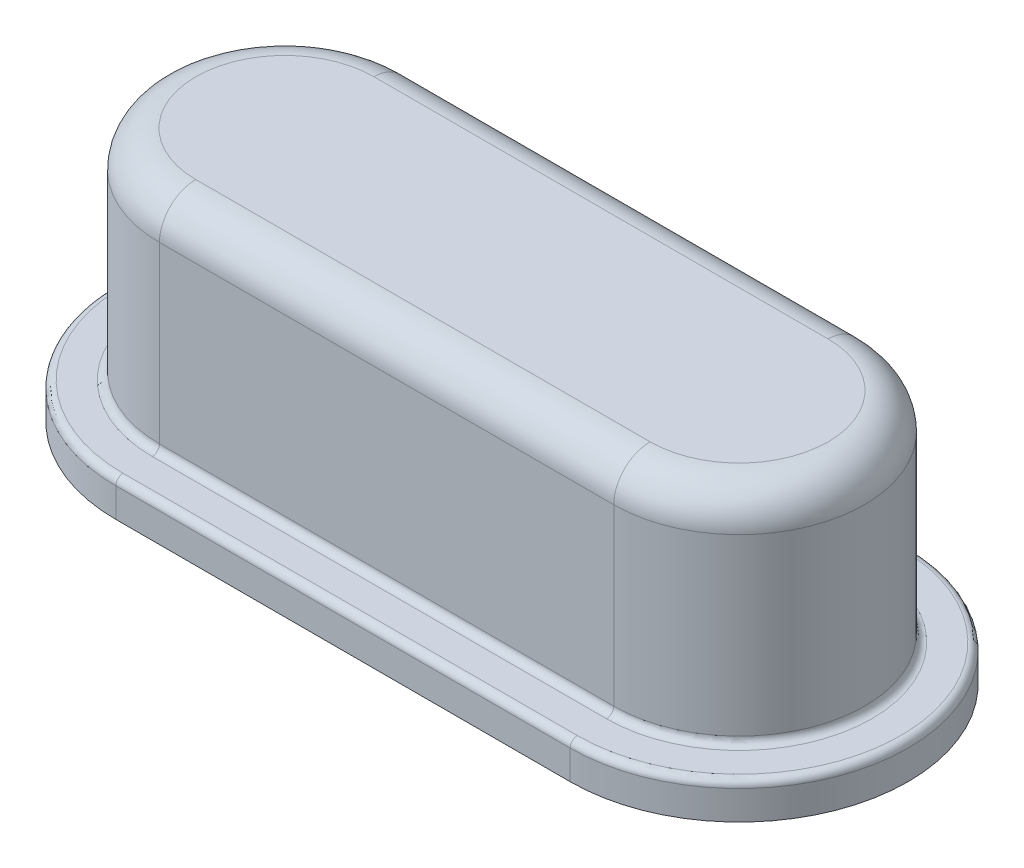
ISO-10303-21;
HEADER;
FILE_DESCRIPTION(('STEP AP214'),'2;1');
FILE_NAME('part.step','',(''),(''),'','','');
FILE_SCHEMA(('AUTOMOTIVE_DESIGN { 1 0 10303 214 1 1 1 1 }'));
ENDSEC;
DATA;
#1=APPLICATION_CONTEXT('core data for automotive mechanical design processes');
#2=APPLICATION_PROTOCOL_DEFINITION('international standard','automotive_design',2000,#1);
#3=PRODUCT_CONTEXT('',#1,'mechanical');
#4=PRODUCT('Part','Part','',(#3));
#5=PRODUCT_RELATED_PRODUCT_CATEGORY('part','',(#4));
#6=PRODUCT_DEFINITION_FORMATION('','',#4);
#7=PRODUCT_DEFINITION_CONTEXT('part definition',#1,'design');
#8=PRODUCT_DEFINITION('design','',#6,#7);
#9=PRODUCT_DEFINITION_SHAPE('','',#8);
#10=(LENGTH_UNIT() NAMED_UNIT(*) SI_UNIT(.MILLI.,.METRE.));
#11=(NAMED_UNIT(*) PLANE_ANGLE_UNIT() SI_UNIT($,.RADIAN.));
#12=(NAMED_UNIT(*) SI_UNIT($,.STERADIAN.) SOLID_ANGLE_UNIT());
#13=UNCERTAINTY_MEASURE_WITH_UNIT(LENGTH_MEASURE(1.E-05),#10,'distance_accuracy_value','');
#14=(GEOMETRIC_REPRESENTATION_CONTEXT(3) GLOBAL_UNCERTAINTY_ASSIGNED_CONTEXT((#13)) GLOBAL_UNIT_ASSIGNED_CONTEXT((#10,
#11,#12)) REPRESENTATION_CONTEXT('',''));
#15=CARTESIAN_POINT('',(0.,0.,0.));
#16=DIRECTION('',(0.,0.,1.));
#17=DIRECTION('',(1.,0.,0.));
#18=AXIS2_PLACEMENT_3D('',#15,#16,#17);
#19=CARTESIAN_POINT('',(-3.125,3.5,0.));
#20=DIRECTION('',(0.,1.,0.));
#21=DIRECTION('',(0.,0.,1.));
#22=AXIS2_PLACEMENT_3D('',#19,#20,#21);
#23=PLANE('',#22);
#24=CARTESIAN_POINT('',(-3.125,3.5,0.));
#25=DIRECTION('',(0.,-1.,0.));
#26=DIRECTION('',(0.,0.,1.));
#27=AXIS2_PLACEMENT_3D('',#24,#25,#26);
#28=CIRCLE('',#27,1.225);
#29=CARTESIAN_POINT('',(-3.125,3.5,1.225));
#30=VERTEX_POINT('',#29);
#31=CARTESIAN_POINT('',(-3.125,3.5,-1.225));
#32=VERTEX_POINT('',#31);
#33=EDGE_CURVE('P0_E336',#30,#32,#28,.T.);
#34=ORIENTED_EDGE('',*,*,#33,.F.);
#35=DIRECTION('',(-1.,0.,0.));
#36=VECTOR('',#35,1.);
#37=CARTESIAN_POINT('',(-3.125,3.5,1.225));
#38=LINE('',#37,#36);
#39=CARTESIAN_POINT('',(3.125,3.5,1.225));
#40=VERTEX_POINT('',#39);
#41=EDGE_CURVE('P0_E321',#40,#30,#38,.T.);
#42=ORIENTED_EDGE('',*,*,#41,.F.);
#43=CARTESIAN_POINT('',(3.125,3.5,0.));
#44=DIRECTION('',(0.,-1.,0.));
#45=DIRECTION('',(0.,0.,-1.));
#46=AXIS2_PLACEMENT_3D('',#43,#44,#45);
#47=CIRCLE('',#46,1.225);
#48=CARTESIAN_POINT('',(3.125,3.5,-1.225));
#49=VERTEX_POINT('',#48);
#50=EDGE_CURVE('P0_E314',#49,#40,#47,.T.);
#51=ORIENTED_EDGE('',*,*,#50,.F.);
#52=DIRECTION('',(1.,0.,0.));
#53=VECTOR('',#52,1.);
#54=CARTESIAN_POINT('',(-3.125,3.5,-1.225));
#55=LINE('',#54,#53);
#56=EDGE_CURVE('P0_E300',#32,#49,#55,.T.);
#57=ORIENTED_EDGE('',*,*,#56,.F.);
#58=EDGE_LOOP('',(#34,#42,#51,#57));
#59=FACE_BOUND('',#58,.T.);
#60=ADVANCED_FACE('P0_F16',(#59),#23,.T.);
#61=CARTESIAN_POINT('',(-3.125,3.,-1.225));
#62=DIRECTION('',(1.,0.,0.));
#63=DIRECTION('',(0.,0.,-1.));
#64=AXIS2_PLACEMENT_3D('',#61,#62,#63);
#65=CYLINDRICAL_SURFACE('',#64,0.5);
#66=CARTESIAN_POINT('',(-3.125,3.,-1.225));
#67=DIRECTION('',(-1.,0.,0.));
#68=DIRECTION('',(0.,0.,-1.));
#69=AXIS2_PLACEMENT_3D('',#66,#67,#68);
#70=CIRCLE('',#69,0.5);
#71=CARTESIAN_POINT('',(-3.125,3.,-1.725));
#72=VERTEX_POINT('',#71);
#73=EDGE_CURVE('P0_E306',#32,#72,#70,.T.);
#74=ORIENTED_EDGE('',*,*,#73,.F.);
#75=ORIENTED_EDGE('',*,*,#56,.T.);
#76=CARTESIAN_POINT('',(3.125,3.,-1.225));
#77=DIRECTION('',(-1.,0.,0.));
#78=DIRECTION('',(0.,0.,-1.));
#79=AXIS2_PLACEMENT_3D('',#76,#77,#78);
#80=CIRCLE('',#79,0.5);
#81=CARTESIAN_POINT('',(3.125,3.,-1.725));
#82=VERTEX_POINT('',#81);
#83=EDGE_CURVE('P0_E304',#82,#49,#80,.F.);
#84=ORIENTED_EDGE('',*,*,#83,.F.);
#85=DIRECTION('',(1.,0.,0.));
#86=VECTOR('',#85,1.);
#87=CARTESIAN_POINT('',(-3.125,3.,-1.725));
#88=LINE('',#87,#86);
#89=EDGE_CURVE('P0_E390',#82,#72,#88,.F.);
#90=ORIENTED_EDGE('',*,*,#89,.T.);
#91=EDGE_LOOP('',(#74,#75,#84,#90));
#92=FACE_BOUND('',#91,.T.);
#93=ADVANCED_FACE('P0_F302',(#92),#65,.T.);
#94=CARTESIAN_POINT('',(3.125,3.,0.));
#95=DIRECTION('',(0.,1.,0.));
#96=DIRECTION('',(0.,0.,1.));
#97=AXIS2_PLACEMENT_3D('',#94,#95,#96);
#98=TOROIDAL_SURFACE('',#97,1.225,0.5);
#99=ORIENTED_EDGE('',*,*,#83,.T.);
#100=ORIENTED_EDGE('',*,*,#50,.T.);
#101=CARTESIAN_POINT('',(3.125,3.,1.225));
#102=DIRECTION('',(-1.,0.,0.));
#103=DIRECTION('',(0.,0.,1.));
#104=AXIS2_PLACEMENT_3D('',#101,#102,#103);
#105=CIRCLE('',#104,0.5);
#106=CARTESIAN_POINT('',(3.125,3.,1.725));
#107=VERTEX_POINT('',#106);
#108=EDGE_CURVE('P0_E322',#107,#40,#105,.T.);
#109=ORIENTED_EDGE('',*,*,#108,.F.);
#110=CARTESIAN_POINT('',(3.125,3.,0.));
#111=DIRECTION('',(0.,-1.,0.));
#112=DIRECTION('',(0.,0.,-1.));
#113=AXIS2_PLACEMENT_3D('',#110,#111,#112);
#114=CIRCLE('',#113,1.725);
#115=EDGE_CURVE('P0_E317',#82,#107,#114,.T.);
#116=ORIENTED_EDGE('',*,*,#115,.F.);
#117=EDGE_LOOP('',(#99,#100,#109,#116));
#118=FACE_BOUND('',#117,.T.);
#119=ADVANCED_FACE('P0_F312',(#118),#98,.T.);
#120=CARTESIAN_POINT('',(-3.125,3.,1.225));
#121=DIRECTION('',(-1.,0.,0.));
#122=DIRECTION('',(0.,0.,1.));
#123=AXIS2_PLACEMENT_3D('',#120,#121,#122);
#124=CYLINDRICAL_SURFACE('',#123,0.5);
#125=ORIENTED_EDGE('',*,*,#108,.T.);
#126=ORIENTED_EDGE('',*,*,#41,.T.);
#127=CARTESIAN_POINT('',(-3.125,3.,1.225));
#128=DIRECTION('',(1.,0.,0.));
#129=DIRECTION('',(0.,0.,1.));
#130=AXIS2_PLACEMENT_3D('',#127,#128,#129);
#131=CIRCLE('',#130,0.5);
#132=CARTESIAN_POINT('',(-3.125,3.,1.725));
#133=VERTEX_POINT('',#132);
#134=EDGE_CURVE('P0_E379',#133,#30,#131,.F.);
#135=ORIENTED_EDGE('',*,*,#134,.F.);
#136=DIRECTION('',(-1.,0.,0.));
#137=VECTOR('',#136,1.);
#138=CARTESIAN_POINT('',(-3.125,3.,1.725));
#139=LINE('',#138,#137);
#140=EDGE_CURVE('P0_E373',#133,#107,#139,.F.);
#141=ORIENTED_EDGE('',*,*,#140,.T.);
#142=EDGE_LOOP('',(#125,#126,#135,#141));
#143=FACE_BOUND('',#142,.T.);
#144=ADVANCED_FACE('P0_F365',(#143),#124,.T.);
#145=CARTESIAN_POINT('',(-3.125,3.,0.));
#146=DIRECTION('',(0.,1.,0.));
#147=DIRECTION('',(0.,0.,1.));
#148=AXIS2_PLACEMENT_3D('',#145,#146,#147);
#149=TOROIDAL_SURFACE('',#148,1.225,0.5);
#150=ORIENTED_EDGE('',*,*,#73,.T.);
#151=CARTESIAN_POINT('',(-3.125,3.,0.));
#152=DIRECTION('',(0.,-1.,0.));
#153=DIRECTION('',(0.,0.,-1.));
#154=AXIS2_PLACEMENT_3D('',#151,#152,#153);
#155=CIRCLE('',#154,1.725);
#156=EDGE_CURVE('P0_E383',#133,#72,#155,.T.);
#157=ORIENTED_EDGE('',*,*,#156,.F.);
#158=ORIENTED_EDGE('',*,*,#134,.T.);
#159=ORIENTED_EDGE('',*,*,#33,.T.);
#160=EDGE_LOOP('',(#150,#157,#158,#159));
#161=FACE_BOUND('',#160,.T.);
#162=ADVANCED_FACE('P0_F353',(#161),#149,.T.);
#163=CARTESIAN_POINT('',(-3.125,3.5,-1.725));
#164=DIRECTION('',(0.,0.,1.));
#165=DIRECTION('',(1.,0.,0.));
#166=AXIS2_PLACEMENT_3D('',#163,#164,#165);
#167=PLANE('',#166);
#168=DIRECTION('',(-1.,0.,0.));
#169=VECTOR('',#168,1.);
#170=CARTESIAN_POINT('',(-3.125,0.6,-1.725));
#171=LINE('',#170,#169);
#172=CARTESIAN_POINT('',(3.125,0.6,-1.725));
#173=VERTEX_POINT('',#172);
#174=CARTESIAN_POINT('',(-3.125,0.6,-1.725));
#175=VERTEX_POINT('',#174);
#176=EDGE_CURVE('P0_E386',#173,#175,#171,.T.);
#177=ORIENTED_EDGE('',*,*,#176,.T.);
#178=DIRECTION('',(0.,-1.,0.));
#179=VECTOR('',#178,1.);
#180=CARTESIAN_POINT('',(-3.125,3.5,-1.725));
#181=LINE('',#180,#179);
#182=EDGE_CURVE('P0_E614',#72,#175,#181,.T.);
#183=ORIENTED_EDGE('',*,*,#182,.F.);
#184=ORIENTED_EDGE('',*,*,#89,.F.);
#185=DIRECTION('',(0.,-1.,0.));
#186=VECTOR('',#185,1.);
#187=CARTESIAN_POINT('',(3.125,3.5,-1.725));
#188=LINE('',#187,#186);
#189=EDGE_CURVE('P0_E392',#173,#82,#188,.F.);
#190=ORIENTED_EDGE('',*,*,#189,.F.);
#191=EDGE_LOOP('',(#177,#183,#184,#190));
#192=FACE_BOUND('',#191,.T.);
#193=ADVANCED_FACE('P0_F364',(#192),#167,.F.);
#194=CARTESIAN_POINT('',(3.125,3.5,0.));
#195=DIRECTION('',(0.,-1.,0.));
#196=DIRECTION('',(0.,0.,-1.));
#197=AXIS2_PLACEMENT_3D('',#194,#195,#196);
#198=CYLINDRICAL_SURFACE('',#197,1.725);
#199=ORIENTED_EDGE('',*,*,#189,.T.);
#200=ORIENTED_EDGE('',*,*,#115,.T.);
#201=DIRECTION('',(0.,1.,0.));
#202=VECTOR('',#201,1.);
#203=CARTESIAN_POINT('',(3.125,3.5,1.725));
#204=LINE('',#203,#202);
#205=CARTESIAN_POINT('',(3.125,0.6,1.725));
#206=VERTEX_POINT('',#205);
#207=EDGE_CURVE('P0_E376',#107,#206,#204,.F.);
#208=ORIENTED_EDGE('',*,*,#207,.T.);
#209=CARTESIAN_POINT('',(3.125,0.6,0.));
#210=DIRECTION('',(0.,1.,0.));
#211=DIRECTION('',(0.,0.,1.));
#212=AXIS2_PLACEMENT_3D('',#209,#210,#211);
#213=CIRCLE('',#212,1.725);
#214=EDGE_CURVE('P0_E624',#206,#173,#213,.T.);
#215=ORIENTED_EDGE('',*,*,#214,.T.);
#216=EDGE_LOOP('',(#199,#200,#208,#215));
#217=FACE_BOUND('',#216,.T.);
#218=ADVANCED_FACE('P0_F506',(#217),#198,.T.);
#219=CARTESIAN_POINT('',(-3.125,3.5,1.725));
#220=DIRECTION('',(0.,0.,-1.));
#221=DIRECTION('',(-1.,0.,0.));
#222=AXIS2_PLACEMENT_3D('',#219,#220,#221);
#223=PLANE('',#222);
#224=DIRECTION('',(1.,0.,0.));
#225=VECTOR('',#224,1.);
#226=CARTESIAN_POINT('',(-3.125,0.6,1.725));
#227=LINE('',#226,#225);
#228=CARTESIAN_POINT('',(-3.125,0.6,1.725));
#229=VERTEX_POINT('',#228);
#230=EDGE_CURVE('P0_E611',#229,#206,#227,.T.);
#231=ORIENTED_EDGE('',*,*,#230,.T.);
#232=ORIENTED_EDGE('',*,*,#207,.F.);
#233=ORIENTED_EDGE('',*,*,#140,.F.);
#234=DIRECTION('',(0.,-1.,0.));
#235=VECTOR('',#234,1.);
#236=CARTESIAN_POINT('',(-3.125,3.5,1.725));
#237=LINE('',#236,#235);
#238=EDGE_CURVE('P0_E387',#229,#133,#237,.F.);
#239=ORIENTED_EDGE('',*,*,#238,.F.);
#240=EDGE_LOOP('',(#231,#232,#233,#239));
#241=FACE_BOUND('',#240,.T.);
#242=ADVANCED_FACE('P0_F498',(#241),#223,.F.);
#243=CARTESIAN_POINT('',(-3.125,3.5,0.));
#244=DIRECTION('',(0.,-1.,0.));
#245=DIRECTION('',(0.,0.,-1.));
#246=AXIS2_PLACEMENT_3D('',#243,#244,#245);
#247=CYLINDRICAL_SURFACE('',#246,1.725);
#248=ORIENTED_EDGE('',*,*,#238,.T.);
#249=ORIENTED_EDGE('',*,*,#156,.T.);
#250=ORIENTED_EDGE('',*,*,#182,.T.);
#251=CARTESIAN_POINT('',(-3.125,0.6,0.));
#252=DIRECTION('',(0.,1.,0.));
#253=DIRECTION('',(0.,0.,1.));
#254=AXIS2_PLACEMENT_3D('',#251,#252,#253);
#255=CIRCLE('',#254,1.725);
#256=EDGE_CURVE('P0_E645',#175,#229,#255,.T.);
#257=ORIENTED_EDGE('',*,*,#256,.T.);
#258=EDGE_LOOP('',(#248,#249,#250,#257));
#259=FACE_BOUND('',#258,.T.);
#260=ADVANCED_FACE('P0_F490',(#259),#247,.T.);
#261=CARTESIAN_POINT('',(-3.125,0.6,-1.825));
#262=DIRECTION('',(-1.,0.,0.));
#263=DIRECTION('',(0.,0.,1.));
#264=AXIS2_PLACEMENT_3D('',#261,#262,#263);
#265=CYLINDRICAL_SURFACE('',#264,0.1);
#266=ORIENTED_EDGE('',*,*,#176,.F.);
#267=CARTESIAN_POINT('',(3.125,0.6,-1.825));
#268=DIRECTION('',(-1.,0.,0.));
#269=DIRECTION('',(0.,0.,-1.));
#270=AXIS2_PLACEMENT_3D('',#267,#268,#269);
#271=CIRCLE('',#270,0.1);
#272=CARTESIAN_POINT('',(3.125,0.5,-1.825));
#273=VERTEX_POINT('',#272);
#274=EDGE_CURVE('P0_E630',#173,#273,#271,.F.);
#275=ORIENTED_EDGE('',*,*,#274,.T.);
#276=DIRECTION('',(1.,0.,0.));
#277=VECTOR('',#276,1.);
#278=CARTESIAN_POINT('',(-3.125,0.5,-1.825));
#279=LINE('',#278,#277);
#280=CARTESIAN_POINT('',(-3.125,0.5,-1.825));
#281=VERTEX_POINT('',#280);
#282=EDGE_CURVE('P0_E665',#281,#273,#279,.T.);
#283=ORIENTED_EDGE('',*,*,#282,.F.);
#284=CARTESIAN_POINT('',(-3.125,0.6,-1.825));
#285=DIRECTION('',(-1.,0.,0.));
#286=DIRECTION('',(0.,0.,-1.));
#287=AXIS2_PLACEMENT_3D('',#284,#285,#286);
#288=CIRCLE('',#287,0.1);
#289=EDGE_CURVE('P0_E663',#281,#175,#288,.T.);
#290=ORIENTED_EDGE('',*,*,#289,.T.);
#291=EDGE_LOOP('',(#266,#275,#283,#290));
#292=FACE_BOUND('',#291,.T.);
#293=ADVANCED_FACE('P0_F482',(#292),#265,.F.);
#294=CARTESIAN_POINT('',(3.125,0.6,0.));
#295=DIRECTION('',(0.,1.,0.));
#296=DIRECTION('',(0.,0.,1.));
#297=AXIS2_PLACEMENT_3D('',#294,#295,#296);
#298=TOROIDAL_SURFACE('',#297,1.825,0.1);
#299=CARTESIAN_POINT('',(3.125,0.5,0.));
#300=DIRECTION('',(0.,1.,0.));
#301=DIRECTION('',(0.,0.,1.));
#302=AXIS2_PLACEMENT_3D('',#299,#300,#301);
#303=CIRCLE('',#302,1.825);
#304=CARTESIAN_POINT('',(3.125,0.5,1.825));
#305=VERTEX_POINT('',#304);
#306=EDGE_CURVE('P0_E174',#273,#305,#303,.F.);
#307=ORIENTED_EDGE('',*,*,#306,.F.);
#308=ORIENTED_EDGE('',*,*,#274,.F.);
#309=ORIENTED_EDGE('',*,*,#214,.F.);
#310=CARTESIAN_POINT('',(3.125,0.6,1.825));
#311=DIRECTION('',(1.,0.,0.));
#312=DIRECTION('',(0.,0.,-1.));
#313=AXIS2_PLACEMENT_3D('',#310,#311,#312);
#314=CIRCLE('',#313,0.1);
#315=EDGE_CURVE('P0_E634',#206,#305,#314,.F.);
#316=ORIENTED_EDGE('',*,*,#315,.T.);
#317=EDGE_LOOP('',(#307,#308,#309,#316));
#318=FACE_BOUND('',#317,.T.);
#319=ADVANCED_FACE('P0_F475',(#318),#298,.F.);
#320=CARTESIAN_POINT('',(-3.125,0.6,1.825));
#321=DIRECTION('',(1.,0.,0.));
#322=DIRECTION('',(0.,0.,-1.));
#323=AXIS2_PLACEMENT_3D('',#320,#321,#322);
#324=CYLINDRICAL_SURFACE('',#323,0.1);
#325=DIRECTION('',(1.,0.,0.));
#326=VECTOR('',#325,1.);
#327=CARTESIAN_POINT('',(-3.125,0.5,1.825));
#328=LINE('',#327,#326);
#329=CARTESIAN_POINT('',(-3.125,0.5,1.825));
#330=VERTEX_POINT('',#329);
#331=EDGE_CURVE('P0_E680',#305,#330,#328,.F.);
#332=ORIENTED_EDGE('',*,*,#331,.F.);
#333=ORIENTED_EDGE('',*,*,#315,.F.);
#334=ORIENTED_EDGE('',*,*,#230,.F.);
#335=CARTESIAN_POINT('',(-3.125,0.6,1.825));
#336=DIRECTION('',(1.,0.,0.));
#337=DIRECTION('',(0.,0.,1.));
#338=AXIS2_PLACEMENT_3D('',#335,#336,#337);
#339=CIRCLE('',#338,0.1);
#340=EDGE_CURVE('P0_E648',#229,#330,#339,.F.);
#341=ORIENTED_EDGE('',*,*,#340,.T.);
#342=EDGE_LOOP('',(#332,#333,#334,#341));
#343=FACE_BOUND('',#342,.T.);
#344=ADVANCED_FACE('P0_F468',(#343),#324,.F.);
#345=CARTESIAN_POINT('',(-3.125,0.6,0.));
#346=DIRECTION('',(0.,1.,0.));
#347=DIRECTION('',(0.,0.,1.));
#348=AXIS2_PLACEMENT_3D('',#345,#346,#347);
#349=TOROIDAL_SURFACE('',#348,1.825,0.1);
#350=CARTESIAN_POINT('',(-3.125,0.5,0.));
#351=DIRECTION('',(0.,1.,0.));
#352=DIRECTION('',(0.,0.,-1.));
#353=AXIS2_PLACEMENT_3D('',#350,#351,#352);
#354=CIRCLE('',#353,1.825);
#355=EDGE_CURVE('P0_E123',#330,#281,#354,.F.);
#356=ORIENTED_EDGE('',*,*,#355,.F.);
#357=ORIENTED_EDGE('',*,*,#340,.F.);
#358=ORIENTED_EDGE('',*,*,#256,.F.);
#359=ORIENTED_EDGE('',*,*,#289,.F.);
#360=EDGE_LOOP('',(#356,#357,#358,#359));
#361=FACE_BOUND('',#360,.T.);
#362=ADVANCED_FACE('P0_F190',(#361),#349,.F.);
#363=CARTESIAN_POINT('',(-3.125,0.5,0.));
#364=DIRECTION('',(0.,1.,0.));
#365=DIRECTION('',(0.,0.,1.));
#366=AXIS2_PLACEMENT_3D('',#363,#364,#365);
#367=PLANE('',#366);
#368=CARTESIAN_POINT('',(-3.125,0.5,0.));
#369=DIRECTION('',(0.,-1.,0.));
#370=DIRECTION('',(0.,0.,1.));
#371=AXIS2_PLACEMENT_3D('',#368,#369,#370);
#372=CIRCLE('',#371,2.225);
#373=CARTESIAN_POINT('',(-3.125,0.5,2.225));
#374=VERTEX_POINT('',#373);
#375=CARTESIAN_POINT('',(-3.125,0.5,-2.225));
#376=VERTEX_POINT('',#375);
#377=EDGE_CURVE('P0_E223',#374,#376,#372,.T.);
#378=ORIENTED_EDGE('',*,*,#377,.F.);
#379=DIRECTION('',(-1.,0.,0.));
#380=VECTOR('',#379,1.);
#381=CARTESIAN_POINT('',(-3.125,0.5,2.225));
#382=LINE('',#381,#380);
#383=CARTESIAN_POINT('',(3.125,0.5,2.225));
#384=VERTEX_POINT('',#383);
#385=EDGE_CURVE('P0_E114',#384,#374,#382,.T.);
#386=ORIENTED_EDGE('',*,*,#385,.F.);
#387=CARTESIAN_POINT('',(3.125,0.5,0.));
#388=DIRECTION('',(0.,-1.,0.));
#389=DIRECTION('',(0.,0.,-1.));
#390=AXIS2_PLACEMENT_3D('',#387,#388,#389);
#391=CIRCLE('',#390,2.225);
#392=CARTESIAN_POINT('',(3.125,0.5,-2.225));
#393=VERTEX_POINT('',#392);
#394=EDGE_CURVE('P0_E133',#393,#384,#391,.T.);
#395=ORIENTED_EDGE('',*,*,#394,.F.);
#396=DIRECTION('',(1.,0.,0.));
#397=VECTOR('',#396,1.);
#398=CARTESIAN_POINT('',(-3.125,0.5,-2.225));
#399=LINE('',#398,#397);
#400=EDGE_CURVE('P0_E160',#376,#393,#399,.T.);
#401=ORIENTED_EDGE('',*,*,#400,.F.);
#402=EDGE_LOOP('',(#378,#386,#395,#401));
#403=FACE_BOUND('',#402,.T.);
#404=ORIENTED_EDGE('',*,*,#331,.T.);
#405=ORIENTED_EDGE('',*,*,#355,.T.);
#406=ORIENTED_EDGE('',*,*,#282,.T.);
#407=ORIENTED_EDGE('',*,*,#306,.T.);
#408=EDGE_LOOP('',(#404,#405,#406,#407));
#409=FACE_BOUND('',#408,.T.);
#410=ADVANCED_FACE('P0_F181',(#403,#409),#367,.T.);
#411=CARTESIAN_POINT('',(-3.125,0.4,2.225));
#412=DIRECTION('',(-1.,0.,0.));
#413=DIRECTION('',(0.,0.,1.));
#414=AXIS2_PLACEMENT_3D('',#411,#412,#413);
#415=CYLINDRICAL_SURFACE('',#414,0.1);
#416=CARTESIAN_POINT('',(3.125,0.4,2.225));
#417=DIRECTION('',(1.,0.,0.));
#418=DIRECTION('',(0.,0.,1.));
#419=AXIS2_PLACEMENT_3D('',#416,#417,#418);
#420=CIRCLE('',#419,0.1);
#421=CARTESIAN_POINT('',(3.125,0.4,2.325));
#422=VERTEX_POINT('',#421);
#423=EDGE_CURVE('P0_E122',#384,#422,#420,.T.);
#424=ORIENTED_EDGE('',*,*,#423,.F.);
#425=ORIENTED_EDGE('',*,*,#385,.T.);
#426=CARTESIAN_POINT('',(-3.125,0.4,2.225));
#427=DIRECTION('',(1.,0.,0.));
#428=DIRECTION('',(0.,0.,1.));
#429=AXIS2_PLACEMENT_3D('',#426,#427,#428);
#430=CIRCLE('',#429,0.1);
#431=CARTESIAN_POINT('',(-3.125,0.4,2.325));
#432=VERTEX_POINT('',#431);
#433=EDGE_CURVE('P0_E163',#432,#374,#430,.F.);
#434=ORIENTED_EDGE('',*,*,#433,.F.);
#435=DIRECTION('',(-1.,0.,0.));
#436=VECTOR('',#435,1.);
#437=CARTESIAN_POINT('',(-3.125,0.4,2.325));
#438=LINE('',#437,#436);
#439=EDGE_CURVE('P0_E229',#432,#422,#438,.F.);
#440=ORIENTED_EDGE('',*,*,#439,.T.);
#441=EDGE_LOOP('',(#424,#425,#434,#440));
#442=FACE_BOUND('',#441,.T.);
#443=ADVANCED_FACE('P0_F150',(#442),#415,.T.);
#444=CARTESIAN_POINT('',(3.125,0.4,0.));
#445=DIRECTION('',(0.,1.,0.));
#446=DIRECTION('',(0.,0.,1.));
#447=AXIS2_PLACEMENT_3D('',#444,#445,#446);
#448=TOROIDAL_SURFACE('',#447,2.225,0.1);
#449=CARTESIAN_POINT('',(3.125,0.4,-2.225));
#450=DIRECTION('',(1.,0.,0.));
#451=DIRECTION('',(0.,0.,-1.));
#452=AXIS2_PLACEMENT_3D('',#449,#450,#451);
#453=CIRCLE('',#452,0.1);
#454=CARTESIAN_POINT('',(3.125,0.4,-2.325));
#455=VERTEX_POINT('',#454);
#456=EDGE_CURVE('P0_E164',#393,#455,#453,.F.);
#457=ORIENTED_EDGE('',*,*,#456,.F.);
#458=ORIENTED_EDGE('',*,*,#394,.T.);
#459=ORIENTED_EDGE('',*,*,#423,.T.);
#460=CARTESIAN_POINT('',(3.125,0.4,0.));
#461=DIRECTION('',(0.,-1.,0.));
#462=DIRECTION('',(0.,0.,-1.));
#463=AXIS2_PLACEMENT_3D('',#460,#461,#462);
#464=CIRCLE('',#463,2.325);
#465=EDGE_CURVE('P0_E54',#455,#422,#464,.T.);
#466=ORIENTED_EDGE('',*,*,#465,.F.);
#467=EDGE_LOOP('',(#457,#458,#459,#466));
#468=FACE_BOUND('',#467,.T.);
#469=ADVANCED_FACE('P0_F140',(#468),#448,.T.);
#470=CARTESIAN_POINT('',(-3.125,0.4,-2.225));
#471=DIRECTION('',(1.,0.,0.));
#472=DIRECTION('',(0.,0.,-1.));
#473=AXIS2_PLACEMENT_3D('',#470,#471,#472);
#474=CYLINDRICAL_SURFACE('',#473,0.1);
#475=CARTESIAN_POINT('',(-3.125,0.4,-2.225));
#476=DIRECTION('',(-1.,0.,0.));
#477=DIRECTION('',(0.,0.,-1.));
#478=AXIS2_PLACEMENT_3D('',#475,#476,#477);
#479=CIRCLE('',#478,0.1);
#480=CARTESIAN_POINT('',(-3.125,0.4,-2.325));
#481=VERTEX_POINT('',#480);
#482=EDGE_CURVE('P0_E95',#376,#481,#479,.T.);
#483=ORIENTED_EDGE('',*,*,#482,.F.);
#484=ORIENTED_EDGE('',*,*,#400,.T.);
#485=ORIENTED_EDGE('',*,*,#456,.T.);
#486=DIRECTION('',(1.,0.,0.));
#487=VECTOR('',#486,1.);
#488=CARTESIAN_POINT('',(-3.125,0.4,-2.325));
#489=LINE('',#488,#487);
#490=EDGE_CURVE('P0_E78',#455,#481,#489,.F.);
#491=ORIENTED_EDGE('',*,*,#490,.T.);
#492=EDGE_LOOP('',(#483,#484,#485,#491));
#493=FACE_BOUND('',#492,.T.);
#494=ADVANCED_FACE('P0_F103',(#493),#474,.T.);
#495=CARTESIAN_POINT('',(-3.125,0.4,0.));
#496=DIRECTION('',(0.,1.,0.));
#497=DIRECTION('',(0.,0.,1.));
#498=AXIS2_PLACEMENT_3D('',#495,#496,#497);
#499=TOROIDAL_SURFACE('',#498,2.225,0.1);
#500=ORIENTED_EDGE('',*,*,#482,.T.);
#501=CARTESIAN_POINT('',(-3.125,0.4,0.));
#502=DIRECTION('',(0.,-1.,0.));
#503=DIRECTION('',(0.,0.,-1.));
#504=AXIS2_PLACEMENT_3D('',#501,#502,#503);
#505=CIRCLE('',#504,2.325);
#506=EDGE_CURVE('P0_E71',#432,#481,#505,.T.);
#507=ORIENTED_EDGE('',*,*,#506,.F.);
#508=ORIENTED_EDGE('',*,*,#433,.T.);
#509=ORIENTED_EDGE('',*,*,#377,.T.);
#510=EDGE_LOOP('',(#500,#507,#508,#509));
#511=FACE_BOUND('',#510,.T.);
#512=ADVANCED_FACE('P0_F98',(#511),#499,.T.);
#513=CARTESIAN_POINT('',(-3.125,0.5,2.325));
#514=DIRECTION('',(0.,0.,-1.));
#515=DIRECTION('',(-1.,0.,0.));
#516=AXIS2_PLACEMENT_3D('',#513,#514,#515);
#517=PLANE('',#516);
#518=ORIENTED_EDGE('',*,*,#439,.F.);
#519=DIRECTION('',(0.,-1.,0.));
#520=VECTOR('',#519,1.);
#521=CARTESIAN_POINT('',(-3.125,0.5,2.325));
#522=LINE('',#521,#520);
#523=CARTESIAN_POINT('',(-3.125,0.,2.325));
#524=VERTEX_POINT('',#523);
#525=EDGE_CURVE('P0_E69',#524,#432,#522,.F.);
#526=ORIENTED_EDGE('',*,*,#525,.F.);
#527=DIRECTION('',(1.,0.,0.));
#528=VECTOR('',#527,1.);
#529=CARTESIAN_POINT('',(-3.125,0.,2.325));
#530=LINE('',#529,#528);
#531=CARTESIAN_POINT('',(3.125,0.,2.325));
#532=VERTEX_POINT('',#531);
#533=EDGE_CURVE('P0_E64',#524,#532,#530,.T.);
#534=ORIENTED_EDGE('',*,*,#533,.T.);
#535=DIRECTION('',(0.,-1.,0.));
#536=VECTOR('',#535,1.);
#537=CARTESIAN_POINT('',(3.125,0.5,2.325));
#538=LINE('',#537,#536);
#539=EDGE_CURVE('P0_E48',#422,#532,#538,.T.);
#540=ORIENTED_EDGE('',*,*,#539,.F.);
#541=EDGE_LOOP('',(#518,#526,#534,#540));
#542=FACE_BOUND('',#541,.T.);
#543=ADVANCED_FACE('P0_F67',(#542),#517,.F.);
#544=CARTESIAN_POINT('',(3.125,0.5,0.));
#545=DIRECTION('',(0.,-1.,0.));
#546=DIRECTION('',(0.,0.,-1.));
#547=AXIS2_PLACEMENT_3D('',#544,#545,#546);
#548=CYLINDRICAL_SURFACE('',#547,2.325);
#549=ORIENTED_EDGE('',*,*,#539,.T.);
#550=CARTESIAN_POINT('',(3.125,0.,0.));
#551=DIRECTION('',(0.,-1.,0.));
#552=DIRECTION('',(0.,0.,-1.));
#553=AXIS2_PLACEMENT_3D('',#550,#551,#552);
#554=CIRCLE('',#553,2.325);
#555=CARTESIAN_POINT('',(3.125,0.,-2.325));
#556=VERTEX_POINT('',#555);
#557=EDGE_CURVE('P0_E20',#532,#556,#554,.F.);
#558=ORIENTED_EDGE('',*,*,#557,.T.);
#559=DIRECTION('',(0.,1.,0.));
#560=VECTOR('',#559,1.);
#561=CARTESIAN_POINT('',(3.125,0.5,-2.325));
#562=LINE('',#561,#560);
#563=EDGE_CURVE('P0_E59',#556,#455,#562,.T.);
#564=ORIENTED_EDGE('',*,*,#563,.T.);
#565=ORIENTED_EDGE('',*,*,#465,.T.);
#566=EDGE_LOOP('',(#549,#558,#564,#565));
#567=FACE_BOUND('',#566,.T.);
#568=ADVANCED_FACE('P0_F50',(#567),#548,.T.);
#569=CARTESIAN_POINT('',(-3.125,0.5,-2.325));
#570=DIRECTION('',(0.,0.,1.));
#571=DIRECTION('',(1.,0.,0.));
#572=AXIS2_PLACEMENT_3D('',#569,#570,#571);
#573=PLANE('',#572);
#574=ORIENTED_EDGE('',*,*,#490,.F.);
#575=ORIENTED_EDGE('',*,*,#563,.F.);
#576=DIRECTION('',(1.,0.,0.));
#577=VECTOR('',#576,1.);
#578=CARTESIAN_POINT('',(-3.125,0.,-2.325));
#579=LINE('',#578,#577);
#580=CARTESIAN_POINT('',(-3.125,0.,-2.325));
#581=VERTEX_POINT('',#580);
#582=EDGE_CURVE('P0_E26',#556,#581,#579,.F.);
#583=ORIENTED_EDGE('',*,*,#582,.T.);
#584=DIRECTION('',(0.,-1.,0.));
#585=VECTOR('',#584,1.);
#586=CARTESIAN_POINT('',(-3.125,0.5,-2.325));
#587=LINE('',#586,#585);
#588=EDGE_CURVE('P0_E32',#481,#581,#587,.T.);
#589=ORIENTED_EDGE('',*,*,#588,.F.);
#590=EDGE_LOOP('',(#574,#575,#583,#589));
#591=FACE_BOUND('',#590,.T.);
#592=ADVANCED_FACE('P0_F249',(#591),#573,.F.);
#593=CARTESIAN_POINT('',(-3.125,0.5,0.));
#594=DIRECTION('',(0.,-1.,0.));
#595=DIRECTION('',(0.,0.,-1.));
#596=AXIS2_PLACEMENT_3D('',#593,#594,#595);
#597=CYLINDRICAL_SURFACE('',#596,2.325);
#598=ORIENTED_EDGE('',*,*,#588,.T.);
#599=CARTESIAN_POINT('',(-3.125,0.,0.));
#600=DIRECTION('',(0.,-1.,0.));
#601=DIRECTION('',(0.,0.,-1.));
#602=AXIS2_PLACEMENT_3D('',#599,#600,#601);
#603=CIRCLE('',#602,2.325);
#604=EDGE_CURVE('P0_E11',#581,#524,#603,.F.);
#605=ORIENTED_EDGE('',*,*,#604,.T.);
#606=ORIENTED_EDGE('',*,*,#525,.T.);
#607=ORIENTED_EDGE('',*,*,#506,.T.);
#608=EDGE_LOOP('',(#598,#605,#606,#607));
#609=FACE_BOUND('',#608,.T.);
#610=ADVANCED_FACE('P0_F423',(#609),#597,.T.);
#611=CARTESIAN_POINT('',(-3.125,0.,0.));
#612=DIRECTION('',(0.,1.,0.));
#613=DIRECTION('',(0.,0.,1.));
#614=AXIS2_PLACEMENT_3D('',#611,#612,#613);
#615=PLANE('',#614);
#616=ORIENTED_EDGE('',*,*,#582,.F.);
#617=ORIENTED_EDGE('',*,*,#557,.F.);
#618=ORIENTED_EDGE('',*,*,#533,.F.);
#619=ORIENTED_EDGE('',*,*,#604,.F.);
#620=EDGE_LOOP('',(#616,#617,#618,#619));
#621=FACE_BOUND('',#620,.T.);
#622=ADVANCED_FACE('P0_F63',(#621),#615,.F.);
#623=CLOSED_SHELL('',(#60,#93,#119,#144,#162,#193,#218,#242,#260,#293,#319,#344,#362,#410,#443,
#469,#494,#512,#543,#568,#592,#610,#622));
#624=MANIFOLD_SOLID_BREP('P0_B1',#623);
#625=CARTESIAN_POINT('',(-2.44,-1.,0.));
#626=DIRECTION('',(0.,-1.,0.));
#627=DIRECTION('',(0.,0.,-1.));
#628=AXIS2_PLACEMENT_3D('',#625,#626,#627);
#629=PLANE('',#628);
#630=CARTESIAN_POINT('',(-2.44,-1.,0.));
#631=DIRECTION('',(0.,1.,0.));
#632=DIRECTION('',(0.,0.,1.));
#633=AXIS2_PLACEMENT_3D('',#630,#631,#632);
#634=CIRCLE('',#633,0.25);
#635=CARTESIAN_POINT('',(-2.44,-1.,0.25));
#636=VERTEX_POINT('',#635);
#637=EDGE_CURVE('P1_E17',#636,#636,#634,.T.);
#638=ORIENTED_EDGE('',*,*,#637,.F.);
#639=EDGE_LOOP('',(#638));
#640=FACE_BOUND('',#639,.T.);
#641=ADVANCED_FACE('P1_F14',(#640),#629,.T.);
#642=CARTESIAN_POINT('',(-2.44,0.,0.));
#643=DIRECTION('',(0.,-1.,0.));
#644=DIRECTION('',(0.,0.,-1.));
#645=AXIS2_PLACEMENT_3D('',#642,#643,#644);
#646=PLANE('',#645);
#647=CARTESIAN_POINT('',(-2.44,0.,0.));
#648=DIRECTION('',(0.,1.,0.));
#649=DIRECTION('',(0.,0.,1.));
#650=AXIS2_PLACEMENT_3D('',#647,#648,#649);
#651=CIRCLE('',#650,0.25);
#652=CARTESIAN_POINT('',(-2.44,0.,0.25));
#653=VERTEX_POINT('',#652);
#654=EDGE_CURVE('P1_E10',#653,#653,#651,.F.);
#655=ORIENTED_EDGE('',*,*,#654,.F.);
#656=EDGE_LOOP('',(#655));
#657=FACE_BOUND('',#656,.T.);
#658=ADVANCED_FACE('P1_F29',(#657),#646,.F.);
#659=CARTESIAN_POINT('',(-2.44,-1.,0.));
#660=DIRECTION('',(0.,1.,0.));
#661=DIRECTION('',(0.,0.,1.));
#662=AXIS2_PLACEMENT_3D('',#659,#660,#661);
#663=CYLINDRICAL_SURFACE('',#662,0.25);
#664=ORIENTED_EDGE('',*,*,#654,.T.);
#665=EDGE_LOOP('',(#664));
#666=FACE_BOUND('',#665,.T.);
#667=ORIENTED_EDGE('',*,*,#637,.T.);
#668=EDGE_LOOP('',(#667));
#669=FACE_BOUND('',#668,.T.);
#670=ADVANCED_FACE('P1_F26',(#666,#669),#663,.T.);
#671=CLOSED_SHELL('',(#641,#658,#670));
#672=MANIFOLD_SOLID_BREP('P1_B1',#671);
#673=CARTESIAN_POINT('',(2.44,-1.,0.));
#674=DIRECTION('',(0.,-1.,0.));
#675=DIRECTION('',(0.,0.,-1.));
#676=AXIS2_PLACEMENT_3D('',#673,#674,#675);
#677=PLANE('',#676);
#678=CARTESIAN_POINT('',(2.44,-1.,0.));
#679=DIRECTION('',(0.,1.,0.));
#680=DIRECTION('',(0.,0.,1.));
#681=AXIS2_PLACEMENT_3D('',#678,#679,#680);
#682=CIRCLE('',#681,0.25);
#683=CARTESIAN_POINT('',(2.44,-1.,0.25));
#684=VERTEX_POINT('',#683);
#685=EDGE_CURVE('P2_E17',#684,#684,#682,.T.);
#686=ORIENTED_EDGE('',*,*,#685,.F.);
#687=EDGE_LOOP('',(#686));
#688=FACE_BOUND('',#687,.T.);
#689=ADVANCED_FACE('P2_F14',(#688),#677,.T.);
#690=CARTESIAN_POINT('',(2.44,0.,0.));
#691=DIRECTION('',(0.,-1.,0.));
#692=DIRECTION('',(0.,0.,-1.));
#693=AXIS2_PLACEMENT_3D('',#690,#691,#692);
#694=PLANE('',#693);
#695=CARTESIAN_POINT('',(2.44,0.,0.));
#696=DIRECTION('',(0.,1.,0.));
#697=DIRECTION('',(0.,0.,1.));
#698=AXIS2_PLACEMENT_3D('',#695,#696,#697);
#699=CIRCLE('',#698,0.25);
#700=CARTESIAN_POINT('',(2.44,0.,0.25));
#701=VERTEX_POINT('',#700);
#702=EDGE_CURVE('P2_E10',#701,#701,#699,.F.);
#703=ORIENTED_EDGE('',*,*,#702,.F.);
#704=EDGE_LOOP('',(#703));
#705=FACE_BOUND('',#704,.T.);
#706=ADVANCED_FACE('P2_F29',(#705),#694,.F.);
#707=CARTESIAN_POINT('',(2.44,-1.,0.));
#708=DIRECTION('',(0.,1.,0.));
#709=DIRECTION('',(0.,0.,1.));
#710=AXIS2_PLACEMENT_3D('',#707,#708,#709);
#711=CYLINDRICAL_SURFACE('',#710,0.25);
#712=ORIENTED_EDGE('',*,*,#702,.T.);
#713=EDGE_LOOP('',(#712));
#714=FACE_BOUND('',#713,.T.);
#715=ORIENTED_EDGE('',*,*,#685,.T.);
#716=EDGE_LOOP('',(#715));
#717=FACE_BOUND('',#716,.T.);
#718=ADVANCED_FACE('P2_F26',(#714,#717),#711,.T.);
#719=CLOSED_SHELL('',(#689,#706,#718));
#720=MANIFOLD_SOLID_BREP('P2_B1',#719);
#721=ADVANCED_BREP_SHAPE_REPRESENTATION('',(#18,#624,#672,#720),#14);
#722=SHAPE_DEFINITION_REPRESENTATION(#9,#721);
ENDSEC;
END-ISO-10303-21;
